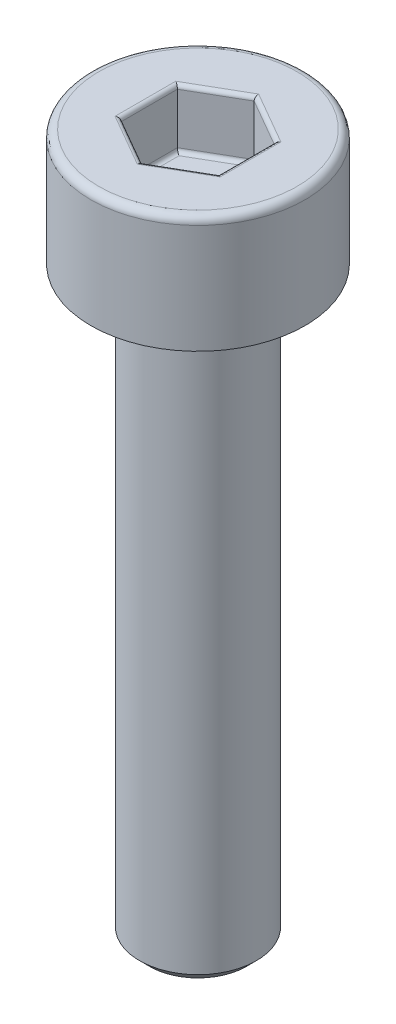
ISO-10303-21;
HEADER;
FILE_DESCRIPTION(('STEP AP214'),'2;1');
FILE_NAME('part.step','',(''),(''),'','','');
FILE_SCHEMA(('AUTOMOTIVE_DESIGN { 1 0 10303 214 1 1 1 1 }'));
ENDSEC;
DATA;
#1=APPLICATION_CONTEXT('core data for automotive mechanical design processes');
#2=APPLICATION_PROTOCOL_DEFINITION('international standard','automotive_design',2000,#1);
#3=PRODUCT_CONTEXT('',#1,'mechanical');
#4=PRODUCT('Part','Part','',(#3));
#5=PRODUCT_RELATED_PRODUCT_CATEGORY('part','',(#4));
#6=PRODUCT_DEFINITION_FORMATION('','',#4);
#7=PRODUCT_DEFINITION_CONTEXT('part definition',#1,'design');
#8=PRODUCT_DEFINITION('design','',#6,#7);
#9=PRODUCT_DEFINITION_SHAPE('','',#8);
#10=(LENGTH_UNIT() NAMED_UNIT(*) SI_UNIT(.MILLI.,.METRE.));
#11=(NAMED_UNIT(*) PLANE_ANGLE_UNIT() SI_UNIT($,.RADIAN.));
#12=(NAMED_UNIT(*) SI_UNIT($,.STERADIAN.) SOLID_ANGLE_UNIT());
#13=UNCERTAINTY_MEASURE_WITH_UNIT(LENGTH_MEASURE(1.E-05),#10,'distance_accuracy_value','');
#14=(GEOMETRIC_REPRESENTATION_CONTEXT(3) GLOBAL_UNCERTAINTY_ASSIGNED_CONTEXT((#13)) GLOBAL_UNIT_ASSIGNED_CONTEXT((#10,
#11,#12)) REPRESENTATION_CONTEXT('',''));
#15=CARTESIAN_POINT('',(0.,0.,0.));
#16=DIRECTION('',(0.,0.,1.));
#17=DIRECTION('',(1.,0.,0.));
#18=AXIS2_PLACEMENT_3D('',#15,#16,#17);
#19=CARTESIAN_POINT('',(0.,-18.,0.));
#20=DIRECTION('',(0.,-1.,0.));
#21=DIRECTION('',(0.,0.,-1.));
#22=AXIS2_PLACEMENT_3D('',#19,#20,#21);
#23=PLANE('',#22);
#24=CARTESIAN_POINT('',(0.,-18.,0.));
#25=DIRECTION('',(0.,-1.,0.));
#26=DIRECTION('',(0.,0.,-1.));
#27=AXIS2_PLACEMENT_3D('',#24,#25,#26);
#28=CIRCLE('',#27,1.25);
#29=CARTESIAN_POINT('',(0.,-18.,-1.25));
#30=VERTEX_POINT('',#29);
#31=EDGE_CURVE('E264',#30,#30,#28,.T.);
#32=ORIENTED_EDGE('',*,*,#31,.T.);
#33=EDGE_LOOP('',(#32));
#34=FACE_BOUND('',#33,.T.);
#35=ADVANCED_FACE('F36',(#34),#23,.T.);
#36=CARTESIAN_POINT('',(0.,0.,0.));
#37=DIRECTION('',(0.,1.,0.));
#38=DIRECTION('',(0.,0.,1.));
#39=AXIS2_PLACEMENT_3D('',#36,#37,#38);
#40=CYLINDRICAL_SURFACE('',#39,1.5);
#41=CARTESIAN_POINT('',(0.,-3.24999999999999,0.));
#42=DIRECTION('',(0.,-1.,0.));
#43=DIRECTION('',(0.,0.,-1.));
#44=AXIS2_PLACEMENT_3D('',#41,#42,#43);
#45=CIRCLE('',#44,1.5);
#46=CARTESIAN_POINT('',(0.,-3.24999999999999,-1.5));
#47=VERTEX_POINT('',#46);
#48=EDGE_CURVE('E261',#47,#47,#45,.T.);
#49=ORIENTED_EDGE('',*,*,#48,.T.);
#50=EDGE_LOOP('',(#49));
#51=FACE_BOUND('',#50,.T.);
#52=CARTESIAN_POINT('',(0.,-17.75,0.));
#53=DIRECTION('',(0.,-1.,0.));
#54=DIRECTION('',(0.,0.,-1.));
#55=AXIS2_PLACEMENT_3D('',#52,#53,#54);
#56=CIRCLE('',#55,1.5);
#57=CARTESIAN_POINT('',(0.,-17.75,-1.5));
#58=VERTEX_POINT('',#57);
#59=EDGE_CURVE('E258',#58,#58,#56,.F.);
#60=ORIENTED_EDGE('',*,*,#59,.T.);
#61=EDGE_LOOP('',(#60));
#62=FACE_BOUND('',#61,.T.);
#63=ADVANCED_FACE('F290',(#51,#62),#40,.T.);
#64=CARTESIAN_POINT('',(-1.5,-3.,0.));
#65=DIRECTION('',(0.,-1.,0.));
#66=DIRECTION('',(0.,0.,-1.));
#67=AXIS2_PLACEMENT_3D('',#64,#65,#66);
#68=PLANE('',#67);
#69=CARTESIAN_POINT('',(0.,-3.,0.));
#70=DIRECTION('',(0.,-1.,0.));
#71=DIRECTION('',(0.,0.,-1.));
#72=AXIS2_PLACEMENT_3D('',#69,#70,#71);
#73=CIRCLE('',#72,1.74999999999999);
#74=CARTESIAN_POINT('',(0.,-3.,-1.74999999999999));
#75=VERTEX_POINT('',#74);
#76=EDGE_CURVE('E255',#75,#75,#73,.F.);
#77=ORIENTED_EDGE('',*,*,#76,.T.);
#78=EDGE_LOOP('',(#77));
#79=FACE_BOUND('',#78,.T.);
#80=CARTESIAN_POINT('',(0.,-3.,0.));
#81=DIRECTION('',(0.,1.,0.));
#82=DIRECTION('',(0.,0.,1.));
#83=AXIS2_PLACEMENT_3D('',#80,#81,#82);
#84=CIRCLE('',#83,2.75);
#85=CARTESIAN_POINT('',(0.,-3.,2.75));
#86=VERTEX_POINT('',#85);
#87=EDGE_CURVE('E252',#86,#86,#84,.T.);
#88=ORIENTED_EDGE('',*,*,#87,.F.);
#89=EDGE_LOOP('',(#88));
#90=FACE_BOUND('',#89,.T.);
#91=ADVANCED_FACE('F296',(#79,#90),#68,.T.);
#92=CARTESIAN_POINT('',(0.,0.,0.));
#93=DIRECTION('',(0.,1.,0.));
#94=DIRECTION('',(0.,0.,1.));
#95=AXIS2_PLACEMENT_3D('',#92,#93,#94);
#96=CYLINDRICAL_SURFACE('',#95,2.75);
#97=CARTESIAN_POINT('',(0.,-0.2,0.));
#98=DIRECTION('',(0.,1.,0.));
#99=DIRECTION('',(0.,0.,1.));
#100=AXIS2_PLACEMENT_3D('',#97,#98,#99);
#101=CIRCLE('',#100,2.75);
#102=CARTESIAN_POINT('',(0.,-0.2,2.75));
#103=VERTEX_POINT('',#102);
#104=EDGE_CURVE('E162',#103,#103,#101,.F.);
#105=ORIENTED_EDGE('',*,*,#104,.T.);
#106=EDGE_LOOP('',(#105));
#107=FACE_BOUND('',#106,.T.);
#108=ORIENTED_EDGE('',*,*,#87,.T.);
#109=EDGE_LOOP('',(#108));
#110=FACE_BOUND('',#109,.T.);
#111=ADVANCED_FACE('F306',(#107,#110),#96,.T.);
#112=CARTESIAN_POINT('',(-2.75,0.,0.));
#113=DIRECTION('',(0.,1.,0.));
#114=DIRECTION('',(0.,0.,1.));
#115=AXIS2_PLACEMENT_3D('',#112,#113,#114);
#116=PLANE('',#115);
#117=DIRECTION('',(0.,0.,1.));
#118=VECTOR('',#117,1.);
#119=CARTESIAN_POINT('',(-1.35,0.,-0.721687836487034));
#120=LINE('',#119,#118);
#121=CARTESIAN_POINT('',(-1.35,0.,0.779422863405994));
#122=VERTEX_POINT('',#121);
#123=CARTESIAN_POINT('',(-1.35,0.,-0.779422863405996));
#124=VERTEX_POINT('',#123);
#125=EDGE_CURVE('E178',#122,#124,#120,.F.);
#126=ORIENTED_EDGE('',*,*,#125,.T.);
#127=DIRECTION('',(-0.866025403784439,0.,0.5));
#128=VECTOR('',#127,1.);
#129=CARTESIAN_POINT('',(-0.0500000000000009,0.,-1.52997821335251));
#130=LINE('',#129,#128);
#131=CARTESIAN_POINT('',(0.,0.,-1.55884572681199));
#132=VERTEX_POINT('',#131);
#133=EDGE_CURVE('E137',#124,#132,#130,.F.);
#134=ORIENTED_EDGE('',*,*,#133,.T.);
#135=DIRECTION('',(-0.866025403784439,0.,-0.5));
#136=VECTOR('',#135,1.);
#137=CARTESIAN_POINT('',(1.3,0.,-0.808290376865478));
#138=LINE('',#137,#136);
#139=CARTESIAN_POINT('',(1.35,0.,-0.779422863405996));
#140=VERTEX_POINT('',#139);
#141=EDGE_CURVE('E164',#132,#140,#138,.F.);
#142=ORIENTED_EDGE('',*,*,#141,.T.);
#143=DIRECTION('',(0.,0.,-1.));
#144=VECTOR('',#143,1.);
#145=CARTESIAN_POINT('',(1.35,0.,0.721687836487032));
#146=LINE('',#145,#144);
#147=CARTESIAN_POINT('',(1.35,0.,0.779422863405995));
#148=VERTEX_POINT('',#147);
#149=EDGE_CURVE('E172',#140,#148,#146,.F.);
#150=ORIENTED_EDGE('',*,*,#149,.T.);
#151=DIRECTION('',(0.866025403784439,0.,-0.5));
#152=VECTOR('',#151,1.);
#153=CARTESIAN_POINT('',(0.0499999999999991,0.,1.52997821335251));
#154=LINE('',#153,#152);
#155=CARTESIAN_POINT('',(0.,0.,1.55884572681199));
#156=VERTEX_POINT('',#155);
#157=EDGE_CURVE('E174',#148,#156,#154,.F.);
#158=ORIENTED_EDGE('',*,*,#157,.T.);
#159=DIRECTION('',(0.866025403784439,0.,0.5));
#160=VECTOR('',#159,1.);
#161=CARTESIAN_POINT('',(-1.3,0.,0.808290376865476));
#162=LINE('',#161,#160);
#163=EDGE_CURVE('E176',#156,#122,#162,.F.);
#164=ORIENTED_EDGE('',*,*,#163,.T.);
#165=EDGE_LOOP('',(#126,#134,#142,#150,#158,#164));
#166=FACE_BOUND('',#165,.T.);
#167=CARTESIAN_POINT('',(0.,0.,0.));
#168=DIRECTION('',(0.,1.,0.));
#169=DIRECTION('',(0.,0.,1.));
#170=AXIS2_PLACEMENT_3D('',#167,#168,#169);
#171=CIRCLE('',#170,2.55);
#172=CARTESIAN_POINT('',(0.,0.,2.55));
#173=VERTEX_POINT('',#172);
#174=EDGE_CURVE('E167',#173,#173,#171,.T.);
#175=ORIENTED_EDGE('',*,*,#174,.T.);
#176=EDGE_LOOP('',(#175));
#177=FACE_BOUND('',#176,.T.);
#178=ADVANCED_FACE('F269',(#166,#177),#116,.T.);
#179=CARTESIAN_POINT('',(0.,-3.,0.));
#180=DIRECTION('',(0.,1.,0.));
#181=DIRECTION('',(0.,0.,1.));
#182=AXIS2_PLACEMENT_3D('',#179,#180,#181);
#183=CONICAL_SURFACE('',#182,1.74999999999999,0.785398163397459);
#184=ORIENTED_EDGE('',*,*,#48,.F.);
#185=EDGE_LOOP('',(#184));
#186=FACE_BOUND('',#185,.T.);
#187=ORIENTED_EDGE('',*,*,#76,.F.);
#188=EDGE_LOOP('',(#187));
#189=FACE_BOUND('',#188,.T.);
#190=ADVANCED_FACE('F284',(#186,#189),#183,.T.);
#191=CARTESIAN_POINT('',(0.,-17.75,0.));
#192=DIRECTION('',(0.,1.,0.));
#193=DIRECTION('',(0.,0.,1.));
#194=AXIS2_PLACEMENT_3D('',#191,#192,#193);
#195=CONICAL_SURFACE('',#194,1.5,0.78539816339745);
#196=ORIENTED_EDGE('',*,*,#31,.F.);
#197=EDGE_LOOP('',(#196));
#198=FACE_BOUND('',#197,.T.);
#199=ORIENTED_EDGE('',*,*,#59,.F.);
#200=EDGE_LOOP('',(#199));
#201=FACE_BOUND('',#200,.T.);
#202=ADVANCED_FACE('F274',(#198,#201),#195,.T.);
#203=CARTESIAN_POINT('',(0.,-0.2,0.));
#204=DIRECTION('',(0.,1.,0.));
#205=DIRECTION('',(0.,0.,1.));
#206=AXIS2_PLACEMENT_3D('',#203,#204,#205);
#207=TOROIDAL_SURFACE('',#206,2.55,0.2);
#208=ORIENTED_EDGE('',*,*,#104,.F.);
#209=EDGE_LOOP('',(#208));
#210=FACE_BOUND('',#209,.T.);
#211=ORIENTED_EDGE('',*,*,#174,.F.);
#212=EDGE_LOOP('',(#211));
#213=FACE_BOUND('',#212,.T.);
#214=ADVANCED_FACE('F271',(#210,#213),#207,.T.);
#215=CARTESIAN_POINT('',(1.25,-1.5,-0.721687836487034));
#216=DIRECTION('',(0.5,0.,-0.866025403784439));
#217=DIRECTION('',(-0.866025403784439,0.,-0.5));
#218=AXIS2_PLACEMENT_3D('',#215,#216,#217);
#219=PLANE('',#218);
#220=DIRECTION('',(0.,1.,0.));
#221=VECTOR('',#220,1.);
#222=CARTESIAN_POINT('',(1.25,-1.5,-0.721687836487034));
#223=LINE('',#222,#221);
#224=CARTESIAN_POINT('',(1.25,-1.4,-0.721687836487034));
#225=VERTEX_POINT('',#224);
#226=CARTESIAN_POINT('',(1.25,-0.1,-0.721687836487034));
#227=VERTEX_POINT('',#226);
#228=EDGE_CURVE('E246',#225,#227,#223,.T.);
#229=ORIENTED_EDGE('',*,*,#228,.T.);
#230=DIRECTION('',(-0.866025403784439,0.,-0.5));
#231=VECTOR('',#230,1.);
#232=CARTESIAN_POINT('',(0.,-0.1,-1.44337567297407));
#233=LINE('',#232,#231);
#234=CARTESIAN_POINT('',(0.,-0.1,-1.44337567297407));
#235=VERTEX_POINT('',#234);
#236=EDGE_CURVE('E198',#227,#235,#233,.T.);
#237=ORIENTED_EDGE('',*,*,#236,.T.);
#238=DIRECTION('',(0.,1.,0.));
#239=VECTOR('',#238,1.);
#240=CARTESIAN_POINT('',(0.,-1.5,-1.44337567297407));
#241=LINE('',#240,#239);
#242=CARTESIAN_POINT('',(0.,-1.4,-1.44337567297407));
#243=VERTEX_POINT('',#242);
#244=EDGE_CURVE('E148',#243,#235,#241,.T.);
#245=ORIENTED_EDGE('',*,*,#244,.F.);
#246=DIRECTION('',(-0.866025403784439,0.,-0.5));
#247=VECTOR('',#246,1.);
#248=CARTESIAN_POINT('',(1.25,-1.4,-0.721687836487034));
#249=LINE('',#248,#247);
#250=EDGE_CURVE('E196',#243,#225,#249,.F.);
#251=ORIENTED_EDGE('',*,*,#250,.T.);
#252=EDGE_LOOP('',(#229,#237,#245,#251));
#253=FACE_BOUND('',#252,.T.);
#254=ADVANCED_FACE('F273',(#253),#219,.F.);
#255=CARTESIAN_POINT('',(1.25,-1.5,0.721687836487032));
#256=DIRECTION('',(1.,0.,0.));
#257=DIRECTION('',(0.,0.,-1.));
#258=AXIS2_PLACEMENT_3D('',#255,#256,#257);
#259=PLANE('',#258);
#260=DIRECTION('',(0.,1.,0.));
#261=VECTOR('',#260,1.);
#262=CARTESIAN_POINT('',(1.25,-1.5,0.721687836487032));
#263=LINE('',#262,#261);
#264=CARTESIAN_POINT('',(1.25,-1.4,0.721687836487032));
#265=VERTEX_POINT('',#264);
#266=CARTESIAN_POINT('',(1.25,-0.1,0.721687836487032));
#267=VERTEX_POINT('',#266);
#268=EDGE_CURVE('E243',#265,#267,#263,.T.);
#269=ORIENTED_EDGE('',*,*,#268,.T.);
#270=DIRECTION('',(0.,0.,-1.));
#271=VECTOR('',#270,1.);
#272=CARTESIAN_POINT('',(1.25,-0.1,-0.721687836487034));
#273=LINE('',#272,#271);
#274=EDGE_CURVE('E194',#267,#227,#273,.T.);
#275=ORIENTED_EDGE('',*,*,#274,.T.);
#276=ORIENTED_EDGE('',*,*,#228,.F.);
#277=DIRECTION('',(0.,0.,-1.));
#278=VECTOR('',#277,1.);
#279=CARTESIAN_POINT('',(1.25,-1.4,0.721687836487032));
#280=LINE('',#279,#278);
#281=EDGE_CURVE('E191',#225,#265,#280,.F.);
#282=ORIENTED_EDGE('',*,*,#281,.T.);
#283=EDGE_LOOP('',(#269,#275,#276,#282));
#284=FACE_BOUND('',#283,.T.);
#285=ADVANCED_FACE('F281',(#284),#259,.F.);
#286=CARTESIAN_POINT('',(0.,-1.5,1.44337567297406));
#287=DIRECTION('',(0.5,0.,0.866025403784439));
#288=DIRECTION('',(0.866025403784439,0.,-0.5));
#289=AXIS2_PLACEMENT_3D('',#286,#287,#288);
#290=PLANE('',#289);
#291=DIRECTION('',(0.,1.,0.));
#292=VECTOR('',#291,1.);
#293=CARTESIAN_POINT('',(0.,-1.5,1.44337567297406));
#294=LINE('',#293,#292);
#295=CARTESIAN_POINT('',(0.,-1.4,1.44337567297406));
#296=VERTEX_POINT('',#295);
#297=CARTESIAN_POINT('',(0.,-0.1,1.44337567297406));
#298=VERTEX_POINT('',#297);
#299=EDGE_CURVE('E240',#296,#298,#294,.T.);
#300=ORIENTED_EDGE('',*,*,#299,.T.);
#301=DIRECTION('',(0.866025403784439,0.,-0.5));
#302=VECTOR('',#301,1.);
#303=CARTESIAN_POINT('',(1.25,-0.1,0.721687836487032));
#304=LINE('',#303,#302);
#305=EDGE_CURVE('E189',#298,#267,#304,.T.);
#306=ORIENTED_EDGE('',*,*,#305,.T.);
#307=ORIENTED_EDGE('',*,*,#268,.F.);
#308=DIRECTION('',(0.866025403784439,0.,-0.5));
#309=VECTOR('',#308,1.);
#310=CARTESIAN_POINT('',(0.,-1.4,1.44337567297406));
#311=LINE('',#310,#309);
#312=EDGE_CURVE('E187',#265,#296,#311,.F.);
#313=ORIENTED_EDGE('',*,*,#312,.T.);
#314=EDGE_LOOP('',(#300,#306,#307,#313));
#315=FACE_BOUND('',#314,.T.);
#316=ADVANCED_FACE('F330',(#315),#290,.F.);
#317=CARTESIAN_POINT('',(-1.25,-1.5,0.721687836487032));
#318=DIRECTION('',(-0.5,0.,0.866025403784439));
#319=DIRECTION('',(0.866025403784439,0.,0.5));
#320=AXIS2_PLACEMENT_3D('',#317,#318,#319);
#321=PLANE('',#320);
#322=DIRECTION('',(0.,1.,0.));
#323=VECTOR('',#322,1.);
#324=CARTESIAN_POINT('',(-1.25,-1.5,0.721687836487032));
#325=LINE('',#324,#323);
#326=CARTESIAN_POINT('',(-1.25,-1.4,0.721687836487032));
#327=VERTEX_POINT('',#326);
#328=CARTESIAN_POINT('',(-1.25,-0.1,0.721687836487032));
#329=VERTEX_POINT('',#328);
#330=EDGE_CURVE('E131',#327,#329,#325,.T.);
#331=ORIENTED_EDGE('',*,*,#330,.T.);
#332=DIRECTION('',(0.866025403784439,0.,0.5));
#333=VECTOR('',#332,1.);
#334=CARTESIAN_POINT('',(0.,-0.1,1.44337567297406));
#335=LINE('',#334,#333);
#336=EDGE_CURVE('E185',#329,#298,#335,.T.);
#337=ORIENTED_EDGE('',*,*,#336,.T.);
#338=ORIENTED_EDGE('',*,*,#299,.F.);
#339=DIRECTION('',(0.866025403784439,0.,0.5));
#340=VECTOR('',#339,1.);
#341=CARTESIAN_POINT('',(-1.25,-1.4,0.721687836487032));
#342=LINE('',#341,#340);
#343=EDGE_CURVE('E183',#296,#327,#342,.F.);
#344=ORIENTED_EDGE('',*,*,#343,.T.);
#345=EDGE_LOOP('',(#331,#337,#338,#344));
#346=FACE_BOUND('',#345,.T.);
#347=ADVANCED_FACE('F237',(#346),#321,.F.);
#348=CARTESIAN_POINT('',(-1.25,-1.5,-0.721687836487034));
#349=DIRECTION('',(-1.,0.,0.));
#350=DIRECTION('',(0.,0.,1.));
#351=AXIS2_PLACEMENT_3D('',#348,#349,#350);
#352=PLANE('',#351);
#353=DIRECTION('',(0.,1.,0.));
#354=VECTOR('',#353,1.);
#355=CARTESIAN_POINT('',(-1.25,-1.5,-0.721687836487034));
#356=LINE('',#355,#354);
#357=CARTESIAN_POINT('',(-1.25,-1.4,-0.721687836487034));
#358=VERTEX_POINT('',#357);
#359=CARTESIAN_POINT('',(-1.25,-0.1,-0.721687836487034));
#360=VERTEX_POINT('',#359);
#361=EDGE_CURVE('E129',#358,#360,#356,.T.);
#362=ORIENTED_EDGE('',*,*,#361,.T.);
#363=DIRECTION('',(0.,0.,1.));
#364=VECTOR('',#363,1.);
#365=CARTESIAN_POINT('',(-1.25,-0.1,0.721687836487032));
#366=LINE('',#365,#364);
#367=EDGE_CURVE('E136',#360,#329,#366,.T.);
#368=ORIENTED_EDGE('',*,*,#367,.T.);
#369=ORIENTED_EDGE('',*,*,#330,.F.);
#370=DIRECTION('',(0.,0.,1.));
#371=VECTOR('',#370,1.);
#372=CARTESIAN_POINT('',(-1.25,-1.4,-0.721687836487034));
#373=LINE('',#372,#371);
#374=EDGE_CURVE('E126',#327,#358,#373,.F.);
#375=ORIENTED_EDGE('',*,*,#374,.T.);
#376=EDGE_LOOP('',(#362,#368,#369,#375));
#377=FACE_BOUND('',#376,.T.);
#378=ADVANCED_FACE('F128',(#377),#352,.F.);
#379=CARTESIAN_POINT('',(0.,-1.5,-1.44337567297407));
#380=DIRECTION('',(-0.5,0.,-0.866025403784439));
#381=DIRECTION('',(-0.866025403784439,0.,0.5));
#382=AXIS2_PLACEMENT_3D('',#379,#380,#381);
#383=PLANE('',#382);
#384=ORIENTED_EDGE('',*,*,#244,.T.);
#385=DIRECTION('',(-0.866025403784439,0.,0.5));
#386=VECTOR('',#385,1.);
#387=CARTESIAN_POINT('',(-1.25,-0.1,-0.721687836487033));
#388=LINE('',#387,#386);
#389=EDGE_CURVE('E147',#235,#360,#388,.T.);
#390=ORIENTED_EDGE('',*,*,#389,.T.);
#391=ORIENTED_EDGE('',*,*,#361,.F.);
#392=DIRECTION('',(-0.866025403784439,0.,0.5));
#393=VECTOR('',#392,1.);
#394=CARTESIAN_POINT('',(0.,-1.4,-1.44337567297407));
#395=LINE('',#394,#393);
#396=EDGE_CURVE('E144',#358,#243,#395,.F.);
#397=ORIENTED_EDGE('',*,*,#396,.T.);
#398=EDGE_LOOP('',(#384,#390,#391,#397));
#399=FACE_BOUND('',#398,.T.);
#400=ADVANCED_FACE('F142',(#399),#383,.F.);
#401=CARTESIAN_POINT('',(1.25,-1.5,-0.721687836487033));
#402=DIRECTION('',(0.,-1.,0.));
#403=DIRECTION('',(0.,0.,-1.));
#404=AXIS2_PLACEMENT_3D('',#401,#402,#403);
#405=PLANE('',#404);
#406=DIRECTION('',(0.866025403784439,0.,-0.5));
#407=VECTOR('',#406,1.);
#408=CARTESIAN_POINT('',(1.2,-1.5,0.635085296108589));
#409=LINE('',#408,#407);
#410=CARTESIAN_POINT('',(0.,-1.5,1.32790561913614));
#411=VERTEX_POINT('',#410);
#412=CARTESIAN_POINT('',(1.15,-1.5,0.66395280956807));
#413=VERTEX_POINT('',#412);
#414=EDGE_CURVE('E45',#411,#413,#409,.T.);
#415=ORIENTED_EDGE('',*,*,#414,.T.);
#416=DIRECTION('',(0.,0.,-1.));
#417=VECTOR('',#416,1.);
#418=CARTESIAN_POINT('',(1.15,-1.5,-0.721687836487034));
#419=LINE('',#418,#417);
#420=CARTESIAN_POINT('',(1.15,-1.5,-0.663952809568071));
#421=VERTEX_POINT('',#420);
#422=EDGE_CURVE('E11',#413,#421,#419,.T.);
#423=ORIENTED_EDGE('',*,*,#422,.T.);
#424=DIRECTION('',(-0.866025403784439,0.,-0.5));
#425=VECTOR('',#424,1.);
#426=CARTESIAN_POINT('',(-0.050000000000001,-1.5,-1.35677313259562));
#427=LINE('',#426,#425);
#428=CARTESIAN_POINT('',(0.,-1.5,-1.32790561913614));
#429=VERTEX_POINT('',#428);
#430=EDGE_CURVE('E200',#421,#429,#427,.T.);
#431=ORIENTED_EDGE('',*,*,#430,.T.);
#432=DIRECTION('',(-0.866025403784439,0.,0.5));
#433=VECTOR('',#432,1.);
#434=CARTESIAN_POINT('',(-1.2,-1.5,-0.635085296108589));
#435=LINE('',#434,#433);
#436=CARTESIAN_POINT('',(-1.15,-1.5,-0.663952809568071));
#437=VERTEX_POINT('',#436);
#438=EDGE_CURVE('E202',#429,#437,#435,.T.);
#439=ORIENTED_EDGE('',*,*,#438,.T.);
#440=DIRECTION('',(0.,0.,1.));
#441=VECTOR('',#440,1.);
#442=CARTESIAN_POINT('',(-1.15,-1.5,0.721687836487032));
#443=LINE('',#442,#441);
#444=CARTESIAN_POINT('',(-1.15,-1.5,0.66395280956807));
#445=VERTEX_POINT('',#444);
#446=EDGE_CURVE('E153',#437,#445,#443,.T.);
#447=ORIENTED_EDGE('',*,*,#446,.T.);
#448=DIRECTION('',(0.866025403784439,0.,0.5));
#449=VECTOR('',#448,1.);
#450=CARTESIAN_POINT('',(0.049999999999999,-1.5,1.35677313259562));
#451=LINE('',#450,#449);
#452=EDGE_CURVE('E56',#445,#411,#451,.T.);
#453=ORIENTED_EDGE('',*,*,#452,.T.);
#454=EDGE_LOOP('',(#415,#423,#431,#439,#447,#453));
#455=FACE_BOUND('',#454,.T.);
#456=ADVANCED_FACE('F325',(#455),#405,.F.);
#457=CARTESIAN_POINT('',(0.0499999999999991,-0.1,1.52997821335251));
#458=DIRECTION('',(-0.866025403784439,0.,0.5));
#459=DIRECTION('',(0.5,0.,0.866025403784439));
#460=AXIS2_PLACEMENT_3D('',#457,#458,#459);
#461=CYLINDRICAL_SURFACE('',#460,0.1);
#462=CARTESIAN_POINT('',(0.,-0.1,1.55884572681199));
#463=DIRECTION('',(-1.,0.,0.));
#464=DIRECTION('',(0.,0.,-1.));
#465=AXIS2_PLACEMENT_3D('',#462,#463,#464);
#466=ELLIPSE('',#465,0.115470053837925,0.1);
#467=EDGE_CURVE('E217',#156,#298,#466,.T.);
#468=ORIENTED_EDGE('',*,*,#467,.F.);
#469=ORIENTED_EDGE('',*,*,#157,.F.);
#470=CARTESIAN_POINT('',(1.35,-0.1,0.779422863405995));
#471=DIRECTION('',(-0.5,0.,0.866025403784439));
#472=DIRECTION('',(-0.866025403784439,0.,-0.5));
#473=AXIS2_PLACEMENT_3D('',#470,#471,#472);
#474=ELLIPSE('',#473,0.115470053837925,0.1);
#475=EDGE_CURVE('E220',#267,#148,#474,.F.);
#476=ORIENTED_EDGE('',*,*,#475,.F.);
#477=ORIENTED_EDGE('',*,*,#305,.F.);
#478=EDGE_LOOP('',(#468,#469,#476,#477));
#479=FACE_BOUND('',#478,.T.);
#480=ADVANCED_FACE('F337',(#479),#461,.T.);
#481=CARTESIAN_POINT('',(1.35,-0.1,0.721687836487032));
#482=DIRECTION('',(0.,0.,1.));
#483=DIRECTION('',(1.,0.,0.));
#484=AXIS2_PLACEMENT_3D('',#481,#482,#483);
#485=CYLINDRICAL_SURFACE('',#484,0.1);
#486=ORIENTED_EDGE('',*,*,#475,.T.);
#487=ORIENTED_EDGE('',*,*,#149,.F.);
#488=CARTESIAN_POINT('',(1.35,-0.1,-0.779422863405996));
#489=DIRECTION('',(0.5,0.,0.866025403784439));
#490=DIRECTION('',(-0.866025403784439,0.,0.5));
#491=AXIS2_PLACEMENT_3D('',#488,#489,#490);
#492=ELLIPSE('',#491,0.115470053837925,0.1);
#493=EDGE_CURVE('E214',#227,#140,#492,.F.);
#494=ORIENTED_EDGE('',*,*,#493,.F.);
#495=ORIENTED_EDGE('',*,*,#274,.F.);
#496=EDGE_LOOP('',(#486,#487,#494,#495));
#497=FACE_BOUND('',#496,.T.);
#498=ADVANCED_FACE('F341',(#497),#485,.T.);
#499=CARTESIAN_POINT('',(-1.3,-0.1,0.808290376865476));
#500=DIRECTION('',(-0.866025403784439,0.,-0.5));
#501=DIRECTION('',(-0.5,0.,0.866025403784439));
#502=AXIS2_PLACEMENT_3D('',#499,#500,#501);
#503=CYLINDRICAL_SURFACE('',#502,0.1);
#504=ORIENTED_EDGE('',*,*,#467,.T.);
#505=ORIENTED_EDGE('',*,*,#336,.F.);
#506=CARTESIAN_POINT('',(-1.35,-0.1,0.779422863405994));
#507=DIRECTION('',(-0.5,0.,-0.866025403784439));
#508=DIRECTION('',(0.866025403784439,0.,-0.5));
#509=AXIS2_PLACEMENT_3D('',#506,#507,#508);
#510=ELLIPSE('',#509,0.115470053837925,0.1);
#511=EDGE_CURVE('E211',#122,#329,#510,.T.);
#512=ORIENTED_EDGE('',*,*,#511,.F.);
#513=ORIENTED_EDGE('',*,*,#163,.F.);
#514=EDGE_LOOP('',(#504,#505,#512,#513));
#515=FACE_BOUND('',#514,.T.);
#516=ADVANCED_FACE('F347',(#515),#503,.T.);
#517=CARTESIAN_POINT('',(1.3,-0.1,-0.808290376865478));
#518=DIRECTION('',(0.866025403784439,0.,0.5));
#519=DIRECTION('',(0.5,0.,-0.866025403784439));
#520=AXIS2_PLACEMENT_3D('',#517,#518,#519);
#521=CYLINDRICAL_SURFACE('',#520,0.1);
#522=ORIENTED_EDGE('',*,*,#493,.T.);
#523=ORIENTED_EDGE('',*,*,#141,.F.);
#524=CARTESIAN_POINT('',(0.,-0.1,-1.55884572681199));
#525=DIRECTION('',(1.,0.,0.));
#526=DIRECTION('',(0.,0.,-1.));
#527=AXIS2_PLACEMENT_3D('',#524,#525,#526);
#528=ELLIPSE('',#527,0.115470053837925,0.1);
#529=EDGE_CURVE('E209',#235,#132,#528,.F.);
#530=ORIENTED_EDGE('',*,*,#529,.F.);
#531=ORIENTED_EDGE('',*,*,#236,.F.);
#532=EDGE_LOOP('',(#522,#523,#530,#531));
#533=FACE_BOUND('',#532,.T.);
#534=ADVANCED_FACE('F377',(#533),#521,.T.);
#535=CARTESIAN_POINT('',(-1.35,-0.1,-0.721687836487034));
#536=DIRECTION('',(0.,0.,-1.));
#537=DIRECTION('',(-1.,0.,0.));
#538=AXIS2_PLACEMENT_3D('',#535,#536,#537);
#539=CYLINDRICAL_SURFACE('',#538,0.1);
#540=ORIENTED_EDGE('',*,*,#511,.T.);
#541=ORIENTED_EDGE('',*,*,#367,.F.);
#542=CARTESIAN_POINT('',(-1.35,-0.1,-0.779422863405996));
#543=DIRECTION('',(0.5,0.,-0.866025403784439));
#544=DIRECTION('',(0.866025403784439,0.,0.5));
#545=AXIS2_PLACEMENT_3D('',#542,#543,#544);
#546=ELLIPSE('',#545,0.115470053837925,0.1);
#547=EDGE_CURVE('E207',#124,#360,#546,.T.);
#548=ORIENTED_EDGE('',*,*,#547,.F.);
#549=ORIENTED_EDGE('',*,*,#125,.F.);
#550=EDGE_LOOP('',(#540,#541,#548,#549));
#551=FACE_BOUND('',#550,.T.);
#552=ADVANCED_FACE('F372',(#551),#539,.T.);
#553=CARTESIAN_POINT('',(-0.0500000000000009,-0.1,-1.52997821335251));
#554=DIRECTION('',(0.866025403784439,0.,-0.5));
#555=DIRECTION('',(-0.5,0.,-0.866025403784439));
#556=AXIS2_PLACEMENT_3D('',#553,#554,#555);
#557=CYLINDRICAL_SURFACE('',#556,0.1);
#558=ORIENTED_EDGE('',*,*,#529,.T.);
#559=ORIENTED_EDGE('',*,*,#133,.F.);
#560=ORIENTED_EDGE('',*,*,#547,.T.);
#561=ORIENTED_EDGE('',*,*,#389,.F.);
#562=EDGE_LOOP('',(#558,#559,#560,#561));
#563=FACE_BOUND('',#562,.T.);
#564=ADVANCED_FACE('F368',(#563),#557,.T.);
#565=CARTESIAN_POINT('',(-1.15,-1.4,-0.721687836487033));
#566=DIRECTION('',(0.,0.,-1.));
#567=DIRECTION('',(-1.,0.,0.));
#568=AXIS2_PLACEMENT_3D('',#565,#566,#567);
#569=CYLINDRICAL_SURFACE('',#568,0.1);
#570=CARTESIAN_POINT('',(-1.15,-1.4,-0.663952809568071));
#571=DIRECTION('',(0.5,0.,-0.866025403784439));
#572=DIRECTION('',(-0.866025403784439,0.,-0.5));
#573=AXIS2_PLACEMENT_3D('',#570,#571,#572);
#574=ELLIPSE('',#573,0.115470053837925,0.1);
#575=EDGE_CURVE('E152',#358,#437,#574,.F.);
#576=ORIENTED_EDGE('',*,*,#575,.F.);
#577=ORIENTED_EDGE('',*,*,#374,.F.);
#578=CARTESIAN_POINT('',(-1.15,-1.4,0.66395280956807));
#579=DIRECTION('',(-0.5,0.,-0.866025403784439));
#580=DIRECTION('',(-0.866025403784439,0.,0.5));
#581=AXIS2_PLACEMENT_3D('',#578,#579,#580);
#582=ELLIPSE('',#581,0.115470053837925,0.1);
#583=EDGE_CURVE('E40',#445,#327,#582,.T.);
#584=ORIENTED_EDGE('',*,*,#583,.F.);
#585=ORIENTED_EDGE('',*,*,#446,.F.);
#586=EDGE_LOOP('',(#576,#577,#584,#585));
#587=FACE_BOUND('',#586,.T.);
#588=ADVANCED_FACE('F38',(#587),#569,.F.);
#589=CARTESIAN_POINT('',(0.0499999999999984,-1.4,1.35677313259562));
#590=DIRECTION('',(-0.866025403784439,0.,-0.5));
#591=DIRECTION('',(-0.5,0.,0.866025403784439));
#592=AXIS2_PLACEMENT_3D('',#589,#590,#591);
#593=CYLINDRICAL_SURFACE('',#592,0.1);
#594=ORIENTED_EDGE('',*,*,#583,.T.);
#595=ORIENTED_EDGE('',*,*,#343,.F.);
#596=CARTESIAN_POINT('',(0.,-1.4,1.32790561913614));
#597=DIRECTION('',(-1.,0.,0.));
#598=DIRECTION('',(0.,0.,1.));
#599=AXIS2_PLACEMENT_3D('',#596,#597,#598);
#600=ELLIPSE('',#599,0.115470053837925,0.1);
#601=EDGE_CURVE('E156',#411,#296,#600,.T.);
#602=ORIENTED_EDGE('',*,*,#601,.F.);
#603=ORIENTED_EDGE('',*,*,#452,.F.);
#604=EDGE_LOOP('',(#594,#595,#602,#603));
#605=FACE_BOUND('',#604,.T.);
#606=ADVANCED_FACE('F234',(#605),#593,.F.);
#607=CARTESIAN_POINT('',(0.674999999999999,-1.4,-1.71761705083914));
#608=DIRECTION('',(0.866025403784439,0.,-0.5));
#609=DIRECTION('',(-0.5,0.,-0.866025403784439));
#610=AXIS2_PLACEMENT_3D('',#607,#608,#609);
#611=CYLINDRICAL_SURFACE('',#610,0.1);
#612=ORIENTED_EDGE('',*,*,#575,.T.);
#613=ORIENTED_EDGE('',*,*,#438,.F.);
#614=CARTESIAN_POINT('',(0.,-1.4,-1.32790561913614));
#615=DIRECTION('',(1.,0.,0.));
#616=DIRECTION('',(0.,0.,-1.));
#617=AXIS2_PLACEMENT_3D('',#614,#615,#616);
#618=ELLIPSE('',#617,0.115470053837925,0.1);
#619=EDGE_CURVE('E160',#243,#429,#618,.F.);
#620=ORIENTED_EDGE('',*,*,#619,.F.);
#621=ORIENTED_EDGE('',*,*,#396,.F.);
#622=EDGE_LOOP('',(#612,#613,#620,#621));
#623=FACE_BOUND('',#622,.T.);
#624=ADVANCED_FACE('F158',(#623),#611,.F.);
#625=CARTESIAN_POINT('',(1.825,-1.4,0.274241377865073));
#626=DIRECTION('',(-0.866025403784439,0.,0.5));
#627=DIRECTION('',(0.5,0.,0.866025403784439));
#628=AXIS2_PLACEMENT_3D('',#625,#626,#627);
#629=CYLINDRICAL_SURFACE('',#628,0.1);
#630=ORIENTED_EDGE('',*,*,#601,.T.);
#631=ORIENTED_EDGE('',*,*,#312,.F.);
#632=CARTESIAN_POINT('',(1.15,-1.4,0.66395280956807));
#633=DIRECTION('',(-0.5,0.,0.866025403784439));
#634=DIRECTION('',(0.866025403784439,0.,0.5));
#635=AXIS2_PLACEMENT_3D('',#632,#633,#634);
#636=ELLIPSE('',#635,0.115470053837925,0.1);
#637=EDGE_CURVE('E225',#413,#265,#636,.T.);
#638=ORIENTED_EDGE('',*,*,#637,.F.);
#639=ORIENTED_EDGE('',*,*,#414,.F.);
#640=EDGE_LOOP('',(#630,#631,#638,#639));
#641=FACE_BOUND('',#640,.T.);
#642=ADVANCED_FACE('F231',(#641),#629,.F.);
#643=CARTESIAN_POINT('',(1.2,-1.4,-0.63508529610859));
#644=DIRECTION('',(0.866025403784439,0.,0.5));
#645=DIRECTION('',(0.5,0.,-0.866025403784439));
#646=AXIS2_PLACEMENT_3D('',#643,#644,#645);
#647=CYLINDRICAL_SURFACE('',#646,0.1);
#648=ORIENTED_EDGE('',*,*,#619,.T.);
#649=ORIENTED_EDGE('',*,*,#430,.F.);
#650=CARTESIAN_POINT('',(1.15,-1.4,-0.663952809568071));
#651=DIRECTION('',(0.5,0.,0.866025403784439));
#652=DIRECTION('',(-0.866025403784439,0.,0.5));
#653=AXIS2_PLACEMENT_3D('',#650,#651,#652);
#654=ELLIPSE('',#653,0.115470053837925,0.1);
#655=EDGE_CURVE('E223',#225,#421,#654,.F.);
#656=ORIENTED_EDGE('',*,*,#655,.F.);
#657=ORIENTED_EDGE('',*,*,#250,.F.);
#658=EDGE_LOOP('',(#648,#649,#656,#657));
#659=FACE_BOUND('',#658,.T.);
#660=ADVANCED_FACE('F356',(#659),#647,.F.);
#661=CARTESIAN_POINT('',(1.15,-1.4,-0.721687836487033));
#662=DIRECTION('',(0.,0.,1.));
#663=DIRECTION('',(1.,0.,0.));
#664=AXIS2_PLACEMENT_3D('',#661,#662,#663);
#665=CYLINDRICAL_SURFACE('',#664,0.1);
#666=ORIENTED_EDGE('',*,*,#637,.T.);
#667=ORIENTED_EDGE('',*,*,#281,.F.);
#668=ORIENTED_EDGE('',*,*,#655,.T.);
#669=ORIENTED_EDGE('',*,*,#422,.F.);
#670=EDGE_LOOP('',(#666,#667,#668,#669));
#671=FACE_BOUND('',#670,.T.);
#672=ADVANCED_FACE('F353',(#671),#665,.F.);
#673=CLOSED_SHELL('',(#35,#63,#91,#111,#178,#190,#202,#214,#254,#285,#316,#347,#378,#400,#456,
#480,#498,#516,#534,#552,#564,#588,#606,#624,#642,#660,#672));
#674=MANIFOLD_SOLID_BREP('B2',#673);
#675=ADVANCED_BREP_SHAPE_REPRESENTATION('',(#18,#674),#14);
#676=SHAPE_DEFINITION_REPRESENTATION(#9,#675);
ENDSEC;
END-ISO-10303-21;
